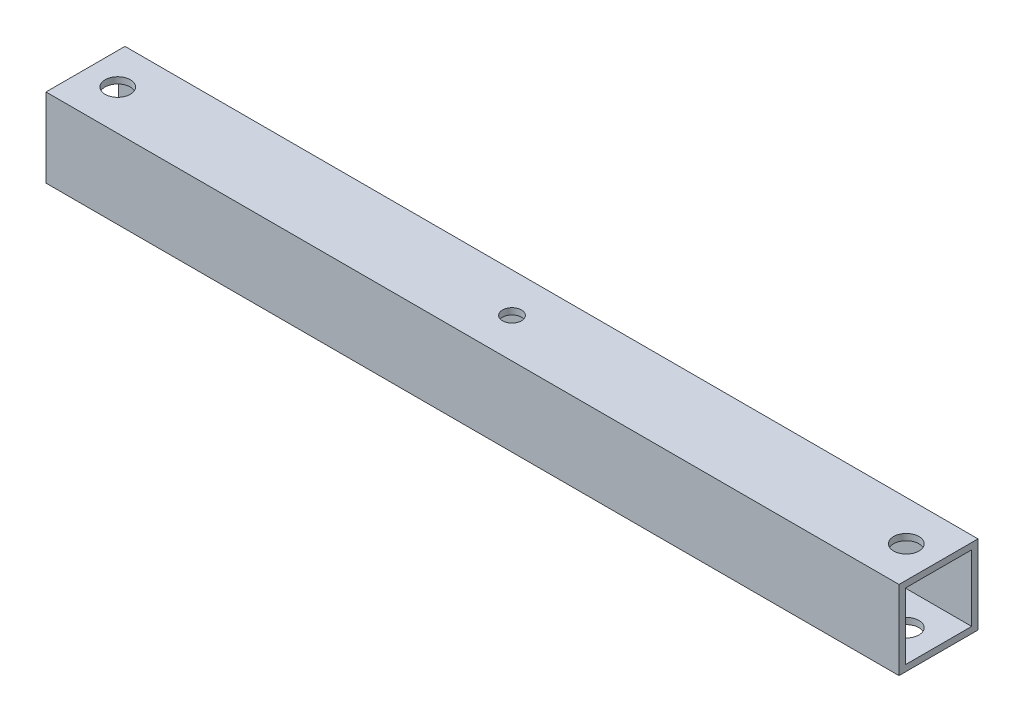
ISO-10303-21;
HEADER;
FILE_DESCRIPTION(('STEP AP214'),'2;1');
FILE_NAME('part.step','',(''),(''),'','','');
FILE_SCHEMA(('AUTOMOTIVE_DESIGN { 1 0 10303 214 1 1 1 1 }'));
ENDSEC;
DATA;
#1=APPLICATION_CONTEXT('core data for automotive mechanical design processes');
#2=APPLICATION_PROTOCOL_DEFINITION('international standard','automotive_design',2000,#1);
#3=PRODUCT_CONTEXT('',#1,'mechanical');
#4=PRODUCT('Part','Part','',(#3));
#5=PRODUCT_RELATED_PRODUCT_CATEGORY('part','',(#4));
#6=PRODUCT_DEFINITION_FORMATION('','',#4);
#7=PRODUCT_DEFINITION_CONTEXT('part definition',#1,'design');
#8=PRODUCT_DEFINITION('design','',#6,#7);
#9=PRODUCT_DEFINITION_SHAPE('','',#8);
#10=(LENGTH_UNIT() NAMED_UNIT(*) SI_UNIT(.MILLI.,.METRE.));
#11=(NAMED_UNIT(*) PLANE_ANGLE_UNIT() SI_UNIT($,.RADIAN.));
#12=(NAMED_UNIT(*) SI_UNIT($,.STERADIAN.) SOLID_ANGLE_UNIT());
#13=UNCERTAINTY_MEASURE_WITH_UNIT(LENGTH_MEASURE(1.E-05),#10,'distance_accuracy_value','');
#14=(GEOMETRIC_REPRESENTATION_CONTEXT(3) GLOBAL_UNCERTAINTY_ASSIGNED_CONTEXT((#13)) GLOBAL_UNIT_ASSIGNED_CONTEXT((#10,
#11,#12)) REPRESENTATION_CONTEXT('',''));
#15=CARTESIAN_POINT('',(0.,0.,0.));
#16=DIRECTION('',(0.,0.,1.));
#17=DIRECTION('',(1.,0.,0.));
#18=AXIS2_PLACEMENT_3D('',#15,#16,#17);
#19=CARTESIAN_POINT('',(270.,0.,0.));
#20=DIRECTION('',(-1.,0.,0.));
#21=DIRECTION('',(0.,0.,1.));
#22=AXIS2_PLACEMENT_3D('',#19,#20,#21);
#23=PLANE('',#22);
#24=DIRECTION('',(0.,-1.,0.));
#25=VECTOR('',#24,1.);
#26=CARTESIAN_POINT('',(270.,0.,0.));
#27=LINE('',#26,#25);
#28=CARTESIAN_POINT('',(270.,25.,0.));
#29=VERTEX_POINT('',#28);
#30=CARTESIAN_POINT('',(270.,0.,0.));
#31=VERTEX_POINT('',#30);
#32=EDGE_CURVE('E138',#29,#31,#27,.T.);
#33=ORIENTED_EDGE('',*,*,#32,.T.);
#34=DIRECTION('',(0.,0.,-1.));
#35=VECTOR('',#34,1.);
#36=CARTESIAN_POINT('',(270.,0.,0.));
#37=LINE('',#36,#35);
#38=CARTESIAN_POINT('',(270.,0.,-25.));
#39=VERTEX_POINT('',#38);
#40=EDGE_CURVE('E141',#31,#39,#37,.T.);
#41=ORIENTED_EDGE('',*,*,#40,.T.);
#42=DIRECTION('',(0.,1.,0.));
#43=VECTOR('',#42,1.);
#44=CARTESIAN_POINT('',(270.,0.,-25.));
#45=LINE('',#44,#43);
#46=CARTESIAN_POINT('',(270.,25.,-25.));
#47=VERTEX_POINT('',#46);
#48=EDGE_CURVE('E144',#39,#47,#45,.T.);
#49=ORIENTED_EDGE('',*,*,#48,.T.);
#50=DIRECTION('',(0.,0.,1.));
#51=VECTOR('',#50,1.);
#52=CARTESIAN_POINT('',(270.,25.,0.));
#53=LINE('',#52,#51);
#54=EDGE_CURVE('E146',#47,#29,#53,.T.);
#55=ORIENTED_EDGE('',*,*,#54,.T.);
#56=EDGE_LOOP('',(#33,#41,#49,#55));
#57=FACE_BOUND('',#56,.T.);
#58=DIRECTION('',(0.,-1.,0.));
#59=VECTOR('',#58,1.);
#60=CARTESIAN_POINT('',(270.,2.,-2.));
#61=LINE('',#60,#59);
#62=CARTESIAN_POINT('',(270.,23.,-2.));
#63=VERTEX_POINT('',#62);
#64=CARTESIAN_POINT('',(270.,2.,-2.));
#65=VERTEX_POINT('',#64);
#66=EDGE_CURVE('E100',#63,#65,#61,.T.);
#67=ORIENTED_EDGE('',*,*,#66,.F.);
#68=DIRECTION('',(0.,0.,1.));
#69=VECTOR('',#68,1.);
#70=CARTESIAN_POINT('',(270.,23.,-2.));
#71=LINE('',#70,#69);
#72=CARTESIAN_POINT('',(270.,23.,-23.));
#73=VERTEX_POINT('',#72);
#74=EDGE_CURVE('E122',#73,#63,#71,.T.);
#75=ORIENTED_EDGE('',*,*,#74,.F.);
#76=DIRECTION('',(0.,1.,0.));
#77=VECTOR('',#76,1.);
#78=CARTESIAN_POINT('',(270.,2.,-23.));
#79=LINE('',#78,#77);
#80=CARTESIAN_POINT('',(270.,2.,-23.));
#81=VERTEX_POINT('',#80);
#82=EDGE_CURVE('E120',#81,#73,#79,.T.);
#83=ORIENTED_EDGE('',*,*,#82,.F.);
#84=DIRECTION('',(0.,0.,-1.));
#85=VECTOR('',#84,1.);
#86=CARTESIAN_POINT('',(270.,2.,-2.));
#87=LINE('',#86,#85);
#88=EDGE_CURVE('E108',#65,#81,#87,.T.);
#89=ORIENTED_EDGE('',*,*,#88,.F.);
#90=EDGE_LOOP('',(#67,#75,#83,#89));
#91=FACE_BOUND('',#90,.T.);
#92=ADVANCED_FACE('F33',(#57,#91),#23,.F.);
#93=CARTESIAN_POINT('',(0.,0.,0.));
#94=DIRECTION('',(-1.,0.,0.));
#95=DIRECTION('',(0.,0.,1.));
#96=AXIS2_PLACEMENT_3D('',#93,#94,#95);
#97=PLANE('',#96);
#98=DIRECTION('',(0.,-1.,0.));
#99=VECTOR('',#98,1.);
#100=CARTESIAN_POINT('',(0.,0.,0.));
#101=LINE('',#100,#99);
#102=CARTESIAN_POINT('',(0.,25.,0.));
#103=VERTEX_POINT('',#102);
#104=CARTESIAN_POINT('',(0.,0.,0.));
#105=VERTEX_POINT('',#104);
#106=EDGE_CURVE('E116',#103,#105,#101,.T.);
#107=ORIENTED_EDGE('',*,*,#106,.F.);
#108=DIRECTION('',(0.,0.,1.));
#109=VECTOR('',#108,1.);
#110=CARTESIAN_POINT('',(0.,25.,0.));
#111=LINE('',#110,#109);
#112=CARTESIAN_POINT('',(0.,25.,-25.));
#113=VERTEX_POINT('',#112);
#114=EDGE_CURVE('E142',#113,#103,#111,.T.);
#115=ORIENTED_EDGE('',*,*,#114,.F.);
#116=DIRECTION('',(0.,1.,0.));
#117=VECTOR('',#116,1.);
#118=CARTESIAN_POINT('',(0.,0.,-25.));
#119=LINE('',#118,#117);
#120=CARTESIAN_POINT('',(0.,0.,-25.));
#121=VERTEX_POINT('',#120);
#122=EDGE_CURVE('E153',#121,#113,#119,.T.);
#123=ORIENTED_EDGE('',*,*,#122,.F.);
#124=DIRECTION('',(0.,0.,-1.));
#125=VECTOR('',#124,1.);
#126=CARTESIAN_POINT('',(0.,0.,0.));
#127=LINE('',#126,#125);
#128=EDGE_CURVE('E151',#105,#121,#127,.T.);
#129=ORIENTED_EDGE('',*,*,#128,.F.);
#130=EDGE_LOOP('',(#107,#115,#123,#129));
#131=FACE_BOUND('',#130,.T.);
#132=DIRECTION('',(0.,0.,1.));
#133=VECTOR('',#132,1.);
#134=CARTESIAN_POINT('',(0.,23.,-2.));
#135=LINE('',#134,#133);
#136=CARTESIAN_POINT('',(0.,23.,-23.));
#137=VERTEX_POINT('',#136);
#138=CARTESIAN_POINT('',(0.,23.,-2.));
#139=VERTEX_POINT('',#138);
#140=EDGE_CURVE('E109',#137,#139,#135,.T.);
#141=ORIENTED_EDGE('',*,*,#140,.T.);
#142=DIRECTION('',(0.,-1.,0.));
#143=VECTOR('',#142,1.);
#144=CARTESIAN_POINT('',(0.,2.,-2.));
#145=LINE('',#144,#143);
#146=CARTESIAN_POINT('',(0.,2.,-2.));
#147=VERTEX_POINT('',#146);
#148=EDGE_CURVE('E58',#139,#147,#145,.T.);
#149=ORIENTED_EDGE('',*,*,#148,.T.);
#150=DIRECTION('',(0.,0.,-1.));
#151=VECTOR('',#150,1.);
#152=CARTESIAN_POINT('',(0.,2.,-2.));
#153=LINE('',#152,#151);
#154=CARTESIAN_POINT('',(0.,2.,-23.));
#155=VERTEX_POINT('',#154);
#156=EDGE_CURVE('E115',#147,#155,#153,.T.);
#157=ORIENTED_EDGE('',*,*,#156,.T.);
#158=DIRECTION('',(0.,1.,0.));
#159=VECTOR('',#158,1.);
#160=CARTESIAN_POINT('',(0.,2.,-23.));
#161=LINE('',#160,#159);
#162=EDGE_CURVE('E130',#155,#137,#161,.T.);
#163=ORIENTED_EDGE('',*,*,#162,.T.);
#164=EDGE_LOOP('',(#141,#149,#157,#163));
#165=FACE_BOUND('',#164,.T.);
#166=ADVANCED_FACE('F211',(#131,#165),#97,.T.);
#167=CARTESIAN_POINT('',(270.,0.,0.));
#168=DIRECTION('',(0.,0.,-1.));
#169=DIRECTION('',(0.,1.,0.));
#170=AXIS2_PLACEMENT_3D('',#167,#168,#169);
#171=PLANE('',#170);
#172=ORIENTED_EDGE('',*,*,#106,.T.);
#173=DIRECTION('',(-1.,0.,0.));
#174=VECTOR('',#173,1.);
#175=CARTESIAN_POINT('',(270.,0.,0.));
#176=LINE('',#175,#174);
#177=EDGE_CURVE('E11',#31,#105,#176,.T.);
#178=ORIENTED_EDGE('',*,*,#177,.F.);
#179=ORIENTED_EDGE('',*,*,#32,.F.);
#180=DIRECTION('',(-1.,0.,0.));
#181=VECTOR('',#180,1.);
#182=CARTESIAN_POINT('',(270.,25.,0.));
#183=LINE('',#182,#181);
#184=EDGE_CURVE('E148',#29,#103,#183,.T.);
#185=ORIENTED_EDGE('',*,*,#184,.T.);
#186=EDGE_LOOP('',(#172,#178,#179,#185));
#187=FACE_BOUND('',#186,.T.);
#188=ADVANCED_FACE('F35',(#187),#171,.F.);
#189=CARTESIAN_POINT('',(270.,0.,0.));
#190=DIRECTION('',(0.,1.,0.));
#191=DIRECTION('',(0.,0.,1.));
#192=AXIS2_PLACEMENT_3D('',#189,#190,#191);
#193=PLANE('',#192);
#194=CARTESIAN_POINT('',(260.,0.,-12.3));
#195=DIRECTION('',(0.,1.,0.));
#196=DIRECTION('',(0.,0.,1.));
#197=AXIS2_PLACEMENT_3D('',#194,#195,#196);
#198=CIRCLE('',#197,3.99999999999999);
#199=CARTESIAN_POINT('',(260.,0.,-8.30000000000001));
#200=VERTEX_POINT('',#199);
#201=EDGE_CURVE('E235',#200,#200,#198,.T.);
#202=ORIENTED_EDGE('',*,*,#201,.T.);
#203=EDGE_LOOP('',(#202));
#204=FACE_BOUND('',#203,.T.);
#205=CARTESIAN_POINT('',(10.,0.,-12.7));
#206=DIRECTION('',(0.,1.,0.));
#207=DIRECTION('',(0.,0.,1.));
#208=AXIS2_PLACEMENT_3D('',#205,#206,#207);
#209=CIRCLE('',#208,4.);
#210=CARTESIAN_POINT('',(10.,0.,-8.7));
#211=VERTEX_POINT('',#210);
#212=EDGE_CURVE('E169',#211,#211,#209,.T.);
#213=ORIENTED_EDGE('',*,*,#212,.T.);
#214=EDGE_LOOP('',(#213));
#215=FACE_BOUND('',#214,.T.);
#216=CARTESIAN_POINT('',(135.,0.,-12.5));
#217=DIRECTION('',(0.,1.,0.));
#218=DIRECTION('',(0.,0.,1.));
#219=AXIS2_PLACEMENT_3D('',#216,#217,#218);
#220=CIRCLE('',#219,2.99999999999999);
#221=CARTESIAN_POINT('',(135.,0.,-9.5));
#222=VERTEX_POINT('',#221);
#223=EDGE_CURVE('E165',#222,#222,#220,.T.);
#224=ORIENTED_EDGE('',*,*,#223,.T.);
#225=EDGE_LOOP('',(#224));
#226=FACE_BOUND('',#225,.T.);
#227=ORIENTED_EDGE('',*,*,#128,.T.);
#228=DIRECTION('',(-1.,0.,0.));
#229=VECTOR('',#228,1.);
#230=CARTESIAN_POINT('',(270.,0.,-25.));
#231=LINE('',#230,#229);
#232=EDGE_CURVE('E42',#39,#121,#231,.T.);
#233=ORIENTED_EDGE('',*,*,#232,.F.);
#234=ORIENTED_EDGE('',*,*,#40,.F.);
#235=ORIENTED_EDGE('',*,*,#177,.T.);
#236=EDGE_LOOP('',(#227,#233,#234,#235));
#237=FACE_BOUND('',#236,.T.);
#238=ADVANCED_FACE('F225',(#204,#215,#226,#237),#193,.F.);
#239=CARTESIAN_POINT('',(270.,0.,-25.));
#240=DIRECTION('',(0.,0.,1.));
#241=DIRECTION('',(0.,-1.,0.));
#242=AXIS2_PLACEMENT_3D('',#239,#240,#241);
#243=PLANE('',#242);
#244=ORIENTED_EDGE('',*,*,#122,.T.);
#245=DIRECTION('',(-1.,0.,0.));
#246=VECTOR('',#245,1.);
#247=CARTESIAN_POINT('',(270.,25.,-25.));
#248=LINE('',#247,#246);
#249=EDGE_CURVE('E158',#47,#113,#248,.T.);
#250=ORIENTED_EDGE('',*,*,#249,.F.);
#251=ORIENTED_EDGE('',*,*,#48,.F.);
#252=ORIENTED_EDGE('',*,*,#232,.T.);
#253=EDGE_LOOP('',(#244,#250,#251,#252));
#254=FACE_BOUND('',#253,.T.);
#255=ADVANCED_FACE('F222',(#254),#243,.F.);
#256=CARTESIAN_POINT('',(270.,25.,0.));
#257=DIRECTION('',(0.,-1.,0.));
#258=DIRECTION('',(0.,0.,-1.));
#259=AXIS2_PLACEMENT_3D('',#256,#257,#258);
#260=PLANE('',#259);
#261=CARTESIAN_POINT('',(260.,25.,-12.3));
#262=DIRECTION('',(0.,1.,0.));
#263=DIRECTION('',(0.,0.,1.));
#264=AXIS2_PLACEMENT_3D('',#261,#262,#263);
#265=CIRCLE('',#264,3.99999999999999);
#266=CARTESIAN_POINT('',(260.,25.,-8.30000000000001));
#267=VERTEX_POINT('',#266);
#268=EDGE_CURVE('E282',#267,#267,#265,.T.);
#269=ORIENTED_EDGE('',*,*,#268,.F.);
#270=EDGE_LOOP('',(#269));
#271=FACE_BOUND('',#270,.T.);
#272=CARTESIAN_POINT('',(10.,25.,-12.7));
#273=DIRECTION('',(0.,1.,0.));
#274=DIRECTION('',(0.,0.,1.));
#275=AXIS2_PLACEMENT_3D('',#272,#273,#274);
#276=CIRCLE('',#275,4.);
#277=CARTESIAN_POINT('',(10.,25.,-8.7));
#278=VERTEX_POINT('',#277);
#279=EDGE_CURVE('E176',#278,#278,#276,.T.);
#280=ORIENTED_EDGE('',*,*,#279,.F.);
#281=EDGE_LOOP('',(#280));
#282=FACE_BOUND('',#281,.T.);
#283=CARTESIAN_POINT('',(135.,25.,-12.5));
#284=DIRECTION('',(0.,1.,0.));
#285=DIRECTION('',(0.,0.,1.));
#286=AXIS2_PLACEMENT_3D('',#283,#284,#285);
#287=CIRCLE('',#286,2.99999999999999);
#288=CARTESIAN_POINT('',(135.,25.,-9.5));
#289=VERTEX_POINT('',#288);
#290=EDGE_CURVE('E173',#289,#289,#287,.T.);
#291=ORIENTED_EDGE('',*,*,#290,.F.);
#292=EDGE_LOOP('',(#291));
#293=FACE_BOUND('',#292,.T.);
#294=ORIENTED_EDGE('',*,*,#114,.T.);
#295=ORIENTED_EDGE('',*,*,#184,.F.);
#296=ORIENTED_EDGE('',*,*,#54,.F.);
#297=ORIENTED_EDGE('',*,*,#249,.T.);
#298=EDGE_LOOP('',(#294,#295,#296,#297));
#299=FACE_BOUND('',#298,.T.);
#300=ADVANCED_FACE('F206',(#271,#282,#293,#299),#260,.F.);
#301=CARTESIAN_POINT('',(270.,2.,-2.));
#302=DIRECTION('',(0.,0.,-1.));
#303=DIRECTION('',(-1.,0.,0.));
#304=AXIS2_PLACEMENT_3D('',#301,#302,#303);
#305=PLANE('',#304);
#306=ORIENTED_EDGE('',*,*,#148,.F.);
#307=DIRECTION('',(-1.,0.,0.));
#308=VECTOR('',#307,1.);
#309=CARTESIAN_POINT('',(270.,23.,-2.));
#310=LINE('',#309,#308);
#311=EDGE_CURVE('E104',#63,#139,#310,.T.);
#312=ORIENTED_EDGE('',*,*,#311,.F.);
#313=ORIENTED_EDGE('',*,*,#66,.T.);
#314=DIRECTION('',(-1.,0.,0.));
#315=VECTOR('',#314,1.);
#316=CARTESIAN_POINT('',(270.,2.,-2.));
#317=LINE('',#316,#315);
#318=EDGE_CURVE('E103',#65,#147,#317,.T.);
#319=ORIENTED_EDGE('',*,*,#318,.T.);
#320=EDGE_LOOP('',(#306,#312,#313,#319));
#321=FACE_BOUND('',#320,.T.);
#322=ADVANCED_FACE('F102',(#321),#305,.T.);
#323=CARTESIAN_POINT('',(270.,2.,-2.));
#324=DIRECTION('',(0.,1.,0.));
#325=DIRECTION('',(0.,0.,1.));
#326=AXIS2_PLACEMENT_3D('',#323,#324,#325);
#327=PLANE('',#326);
#328=CARTESIAN_POINT('',(260.,2.,-12.3));
#329=DIRECTION('',(0.,1.,0.));
#330=DIRECTION('',(0.,0.,1.));
#331=AXIS2_PLACEMENT_3D('',#328,#329,#330);
#332=CIRCLE('',#331,3.99999999999999);
#333=CARTESIAN_POINT('',(260.,2.,-8.30000000000001));
#334=VERTEX_POINT('',#333);
#335=EDGE_CURVE('E181',#334,#334,#332,.T.);
#336=ORIENTED_EDGE('',*,*,#335,.F.);
#337=EDGE_LOOP('',(#336));
#338=FACE_BOUND('',#337,.T.);
#339=CARTESIAN_POINT('',(10.,2.,-12.7));
#340=DIRECTION('',(0.,1.,0.));
#341=DIRECTION('',(0.,0.,1.));
#342=AXIS2_PLACEMENT_3D('',#339,#340,#341);
#343=CIRCLE('',#342,4.);
#344=CARTESIAN_POINT('',(10.,2.,-8.7));
#345=VERTEX_POINT('',#344);
#346=EDGE_CURVE('E168',#345,#345,#343,.T.);
#347=ORIENTED_EDGE('',*,*,#346,.F.);
#348=EDGE_LOOP('',(#347));
#349=FACE_BOUND('',#348,.T.);
#350=CARTESIAN_POINT('',(135.,2.,-12.5));
#351=DIRECTION('',(0.,1.,0.));
#352=DIRECTION('',(0.,0.,1.));
#353=AXIS2_PLACEMENT_3D('',#350,#351,#352);
#354=CIRCLE('',#353,2.99999999999999);
#355=CARTESIAN_POINT('',(135.,2.,-9.5));
#356=VERTEX_POINT('',#355);
#357=EDGE_CURVE('E128',#356,#356,#354,.T.);
#358=ORIENTED_EDGE('',*,*,#357,.F.);
#359=EDGE_LOOP('',(#358));
#360=FACE_BOUND('',#359,.T.);
#361=ORIENTED_EDGE('',*,*,#156,.F.);
#362=ORIENTED_EDGE('',*,*,#318,.F.);
#363=ORIENTED_EDGE('',*,*,#88,.T.);
#364=DIRECTION('',(-1.,0.,0.));
#365=VECTOR('',#364,1.);
#366=CARTESIAN_POINT('',(270.,2.,-23.));
#367=LINE('',#366,#365);
#368=EDGE_CURVE('E117',#81,#155,#367,.T.);
#369=ORIENTED_EDGE('',*,*,#368,.T.);
#370=EDGE_LOOP('',(#361,#362,#363,#369));
#371=FACE_BOUND('',#370,.T.);
#372=ADVANCED_FACE('F112',(#338,#349,#360,#371),#327,.T.);
#373=CARTESIAN_POINT('',(270.,2.,-23.));
#374=DIRECTION('',(0.,0.,1.));
#375=DIRECTION('',(1.,0.,0.));
#376=AXIS2_PLACEMENT_3D('',#373,#374,#375);
#377=PLANE('',#376);
#378=ORIENTED_EDGE('',*,*,#162,.F.);
#379=ORIENTED_EDGE('',*,*,#368,.F.);
#380=ORIENTED_EDGE('',*,*,#82,.T.);
#381=DIRECTION('',(-1.,0.,0.));
#382=VECTOR('',#381,1.);
#383=CARTESIAN_POINT('',(270.,23.,-23.));
#384=LINE('',#383,#382);
#385=EDGE_CURVE('E50',#73,#137,#384,.T.);
#386=ORIENTED_EDGE('',*,*,#385,.T.);
#387=EDGE_LOOP('',(#378,#379,#380,#386));
#388=FACE_BOUND('',#387,.T.);
#389=ADVANCED_FACE('F196',(#388),#377,.T.);
#390=CARTESIAN_POINT('',(270.,23.,-2.));
#391=DIRECTION('',(0.,-1.,0.));
#392=DIRECTION('',(0.,0.,-1.));
#393=AXIS2_PLACEMENT_3D('',#390,#391,#392);
#394=PLANE('',#393);
#395=CARTESIAN_POINT('',(260.,23.,-12.3));
#396=DIRECTION('',(0.,-1.,0.));
#397=DIRECTION('',(0.,0.,-1.));
#398=AXIS2_PLACEMENT_3D('',#395,#396,#397);
#399=CIRCLE('',#398,3.99999999999999);
#400=CARTESIAN_POINT('',(260.,23.,-16.3));
#401=VERTEX_POINT('',#400);
#402=EDGE_CURVE('E37',#401,#401,#399,.T.);
#403=ORIENTED_EDGE('',*,*,#402,.F.);
#404=EDGE_LOOP('',(#403));
#405=FACE_BOUND('',#404,.T.);
#406=CARTESIAN_POINT('',(10.,23.,-12.7));
#407=DIRECTION('',(0.,-1.,0.));
#408=DIRECTION('',(0.,0.,-1.));
#409=AXIS2_PLACEMENT_3D('',#406,#407,#408);
#410=CIRCLE('',#409,4.);
#411=CARTESIAN_POINT('',(10.,23.,-16.7));
#412=VERTEX_POINT('',#411);
#413=EDGE_CURVE('E166',#412,#412,#410,.T.);
#414=ORIENTED_EDGE('',*,*,#413,.F.);
#415=EDGE_LOOP('',(#414));
#416=FACE_BOUND('',#415,.T.);
#417=CARTESIAN_POINT('',(135.,23.,-12.5));
#418=DIRECTION('',(0.,-1.,0.));
#419=DIRECTION('',(0.,0.,-1.));
#420=AXIS2_PLACEMENT_3D('',#417,#418,#419);
#421=CIRCLE('',#420,2.99999999999999);
#422=CARTESIAN_POINT('',(135.,23.,-15.5));
#423=VERTEX_POINT('',#422);
#424=EDGE_CURVE('E163',#423,#423,#421,.T.);
#425=ORIENTED_EDGE('',*,*,#424,.F.);
#426=EDGE_LOOP('',(#425));
#427=FACE_BOUND('',#426,.T.);
#428=ORIENTED_EDGE('',*,*,#140,.F.);
#429=ORIENTED_EDGE('',*,*,#385,.F.);
#430=ORIENTED_EDGE('',*,*,#74,.T.);
#431=ORIENTED_EDGE('',*,*,#311,.T.);
#432=EDGE_LOOP('',(#428,#429,#430,#431));
#433=FACE_BOUND('',#432,.T.);
#434=ADVANCED_FACE('F203',(#405,#416,#427,#433),#394,.T.);
#435=CARTESIAN_POINT('',(135.,0.,-12.5));
#436=DIRECTION('',(0.,1.,0.));
#437=DIRECTION('',(0.,0.,1.));
#438=AXIS2_PLACEMENT_3D('',#435,#436,#437);
#439=CYLINDRICAL_SURFACE('',#438,2.99999999999999);
#440=ORIENTED_EDGE('',*,*,#424,.T.);
#441=EDGE_LOOP('',(#440));
#442=FACE_BOUND('',#441,.T.);
#443=ORIENTED_EDGE('',*,*,#290,.T.);
#444=EDGE_LOOP('',(#443));
#445=FACE_BOUND('',#444,.T.);
#446=ADVANCED_FACE('F253',(#442,#445),#439,.F.);
#447=ORIENTED_EDGE('',*,*,#357,.T.);
#448=EDGE_LOOP('',(#447));
#449=FACE_BOUND('',#448,.T.);
#450=ORIENTED_EDGE('',*,*,#223,.F.);
#451=EDGE_LOOP('',(#450));
#452=FACE_BOUND('',#451,.T.);
#453=ADVANCED_FACE('F192',(#449,#452),#439,.F.);
#454=CARTESIAN_POINT('',(10.,0.,-12.7));
#455=DIRECTION('',(0.,1.,0.));
#456=DIRECTION('',(0.,0.,1.));
#457=AXIS2_PLACEMENT_3D('',#454,#455,#456);
#458=CYLINDRICAL_SURFACE('',#457,4.);
#459=ORIENTED_EDGE('',*,*,#413,.T.);
#460=EDGE_LOOP('',(#459));
#461=FACE_BOUND('',#460,.T.);
#462=ORIENTED_EDGE('',*,*,#279,.T.);
#463=EDGE_LOOP('',(#462));
#464=FACE_BOUND('',#463,.T.);
#465=ADVANCED_FACE('F264',(#461,#464),#458,.F.);
#466=ORIENTED_EDGE('',*,*,#346,.T.);
#467=EDGE_LOOP('',(#466));
#468=FACE_BOUND('',#467,.T.);
#469=ORIENTED_EDGE('',*,*,#212,.F.);
#470=EDGE_LOOP('',(#469));
#471=FACE_BOUND('',#470,.T.);
#472=ADVANCED_FACE('F267',(#468,#471),#458,.F.);
#473=CARTESIAN_POINT('',(260.,0.,-12.3));
#474=DIRECTION('',(0.,1.,0.));
#475=DIRECTION('',(0.,0.,1.));
#476=AXIS2_PLACEMENT_3D('',#473,#474,#475);
#477=CYLINDRICAL_SURFACE('',#476,3.99999999999999);
#478=ORIENTED_EDGE('',*,*,#402,.T.);
#479=EDGE_LOOP('',(#478));
#480=FACE_BOUND('',#479,.T.);
#481=ORIENTED_EDGE('',*,*,#268,.T.);
#482=EDGE_LOOP('',(#481));
#483=FACE_BOUND('',#482,.T.);
#484=ADVANCED_FACE('F268',(#480,#483),#477,.F.);
#485=ORIENTED_EDGE('',*,*,#335,.T.);
#486=EDGE_LOOP('',(#485));
#487=FACE_BOUND('',#486,.T.);
#488=ORIENTED_EDGE('',*,*,#201,.F.);
#489=EDGE_LOOP('',(#488));
#490=FACE_BOUND('',#489,.T.);
#491=ADVANCED_FACE('F270',(#487,#490),#477,.F.);
#492=CLOSED_SHELL('',(#92,#166,#188,#238,#255,#300,#322,#372,#389,#434,#446,#453,#465,#472,#484,#491));
#493=MANIFOLD_SOLID_BREP('B2',#492);
#494=ADVANCED_BREP_SHAPE_REPRESENTATION('',(#18,#493),#14);
#495=SHAPE_DEFINITION_REPRESENTATION(#9,#494);
ENDSEC;
END-ISO-10303-21;
